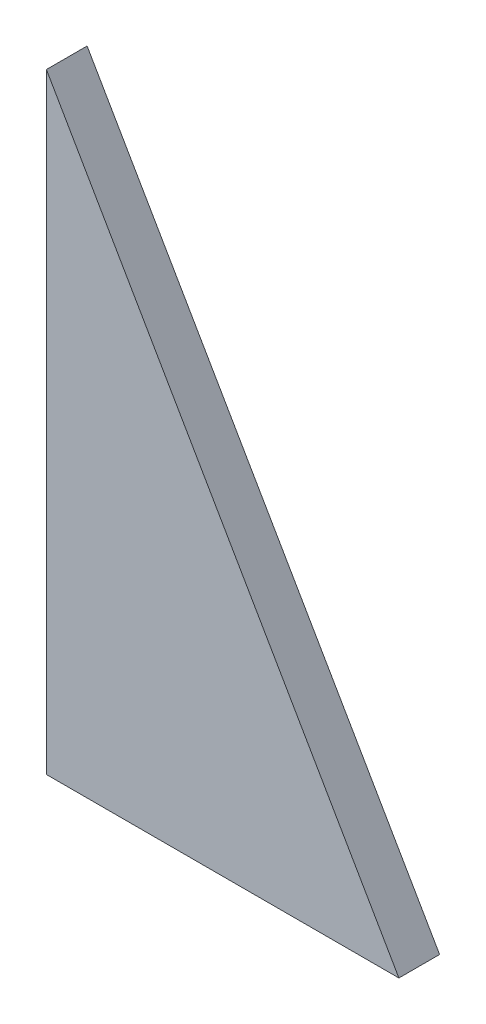
ISO-10303-21;
HEADER;
FILE_DESCRIPTION(('STEP AP214'),'2;1');
FILE_NAME('part.step','',(''),(''),'','','');
FILE_SCHEMA(('AUTOMOTIVE_DESIGN { 1 0 10303 214 1 1 1 1 }'));
ENDSEC;
DATA;
#1=APPLICATION_CONTEXT('core data for automotive mechanical design processes');
#2=APPLICATION_PROTOCOL_DEFINITION('international standard','automotive_design',2000,#1);
#3=PRODUCT_CONTEXT('',#1,'mechanical');
#4=PRODUCT('Part','Part','',(#3));
#5=PRODUCT_RELATED_PRODUCT_CATEGORY('part','',(#4));
#6=PRODUCT_DEFINITION_FORMATION('','',#4);
#7=PRODUCT_DEFINITION_CONTEXT('part definition',#1,'design');
#8=PRODUCT_DEFINITION('design','',#6,#7);
#9=PRODUCT_DEFINITION_SHAPE('','',#8);
#10=(LENGTH_UNIT() NAMED_UNIT(*) SI_UNIT(.MILLI.,.METRE.));
#11=(NAMED_UNIT(*) PLANE_ANGLE_UNIT() SI_UNIT($,.RADIAN.));
#12=(NAMED_UNIT(*) SI_UNIT($,.STERADIAN.) SOLID_ANGLE_UNIT());
#13=UNCERTAINTY_MEASURE_WITH_UNIT(LENGTH_MEASURE(1.E-05),#10,'distance_accuracy_value','');
#14=(GEOMETRIC_REPRESENTATION_CONTEXT(3) GLOBAL_UNCERTAINTY_ASSIGNED_CONTEXT((#13)) GLOBAL_UNIT_ASSIGNED_CONTEXT((#10,
#11,#12)) REPRESENTATION_CONTEXT('',''));
#15=CARTESIAN_POINT('',(0.,0.,0.));
#16=DIRECTION('',(0.,0.,1.));
#17=DIRECTION('',(1.,0.,0.));
#18=AXIS2_PLACEMENT_3D('',#15,#16,#17);
#19=CARTESIAN_POINT('',(0.,0.,1.));
#20=DIRECTION('',(-0.866025403784433,-0.50000000000001,0.));
#21=DIRECTION('',(0.50000000000001,-0.866025403784433,0.));
#22=AXIS2_PLACEMENT_3D('',#19,#20,#21);
#23=PLANE('',#22);
#24=DIRECTION('',(-0.50000000000001,0.866025403784433,0.));
#25=VECTOR('',#24,1.);
#26=CARTESIAN_POINT('',(0.,0.,0.));
#27=LINE('',#26,#25);
#28=CARTESIAN_POINT('',(0.,0.,0.));
#29=VERTEX_POINT('',#28);
#30=CARTESIAN_POINT('',(-8.66025403784463,15.,0.));
#31=VERTEX_POINT('',#30);
#32=EDGE_CURVE('E70',#29,#31,#27,.T.);
#33=ORIENTED_EDGE('',*,*,#32,.T.);
#34=DIRECTION('',(0.,0.,-1.));
#35=VECTOR('',#34,1.);
#36=CARTESIAN_POINT('',(-8.66025403784463,15.,1.));
#37=LINE('',#36,#35);
#38=CARTESIAN_POINT('',(-8.66025403784463,15.,1.));
#39=VERTEX_POINT('',#38);
#40=EDGE_CURVE('E48',#39,#31,#37,.T.);
#41=ORIENTED_EDGE('',*,*,#40,.F.);
#42=DIRECTION('',(-0.50000000000001,0.866025403784433,0.));
#43=VECTOR('',#42,1.);
#44=CARTESIAN_POINT('',(0.,0.,1.));
#45=LINE('',#44,#43);
#46=CARTESIAN_POINT('',(0.,0.,1.));
#47=VERTEX_POINT('',#46);
#48=EDGE_CURVE('E78',#47,#39,#45,.T.);
#49=ORIENTED_EDGE('',*,*,#48,.F.);
#50=DIRECTION('',(0.,0.,-1.));
#51=VECTOR('',#50,1.);
#52=CARTESIAN_POINT('',(0.,0.,1.));
#53=LINE('',#52,#51);
#54=EDGE_CURVE('E11',#47,#29,#53,.T.);
#55=ORIENTED_EDGE('',*,*,#54,.T.);
#56=EDGE_LOOP('',(#33,#41,#49,#55));
#57=FACE_BOUND('',#56,.T.);
#58=ADVANCED_FACE('F39',(#57),#23,.F.);
#59=CARTESIAN_POINT('',(-8.66025403784463,15.,1.));
#60=DIRECTION('',(1.,0.,0.));
#61=DIRECTION('',(0.,0.,-1.));
#62=AXIS2_PLACEMENT_3D('',#59,#60,#61);
#63=PLANE('',#62);
#64=DIRECTION('',(0.,-1.,0.));
#65=VECTOR('',#64,1.);
#66=CARTESIAN_POINT('',(-8.66025403784463,15.,0.));
#67=LINE('',#66,#65);
#68=CARTESIAN_POINT('',(-8.66025403784463,0.,0.));
#69=VERTEX_POINT('',#68);
#70=EDGE_CURVE('E76',#31,#69,#67,.T.);
#71=ORIENTED_EDGE('',*,*,#70,.T.);
#72=DIRECTION('',(0.,0.,-1.));
#73=VECTOR('',#72,1.);
#74=CARTESIAN_POINT('',(-8.66025403784463,0.,1.));
#75=LINE('',#74,#73);
#76=CARTESIAN_POINT('',(-8.66025403784463,0.,1.));
#77=VERTEX_POINT('',#76);
#78=EDGE_CURVE('E90',#77,#69,#75,.T.);
#79=ORIENTED_EDGE('',*,*,#78,.F.);
#80=DIRECTION('',(0.,-1.,0.));
#81=VECTOR('',#80,1.);
#82=CARTESIAN_POINT('',(-8.66025403784463,15.,1.));
#83=LINE('',#82,#81);
#84=EDGE_CURVE('E82',#39,#77,#83,.T.);
#85=ORIENTED_EDGE('',*,*,#84,.F.);
#86=ORIENTED_EDGE('',*,*,#40,.T.);
#87=EDGE_LOOP('',(#71,#79,#85,#86));
#88=FACE_BOUND('',#87,.T.);
#89=ADVANCED_FACE('F103',(#88),#63,.F.);
#90=CARTESIAN_POINT('',(-8.66025403784463,0.,1.));
#91=DIRECTION('',(0.,1.,0.));
#92=DIRECTION('',(0.,0.,1.));
#93=AXIS2_PLACEMENT_3D('',#90,#91,#92);
#94=PLANE('',#93);
#95=DIRECTION('',(1.,0.,0.));
#96=VECTOR('',#95,1.);
#97=CARTESIAN_POINT('',(-8.66025403784463,0.,0.));
#98=LINE('',#97,#96);
#99=EDGE_CURVE('E86',#69,#29,#98,.T.);
#100=ORIENTED_EDGE('',*,*,#99,.T.);
#101=ORIENTED_EDGE('',*,*,#54,.F.);
#102=DIRECTION('',(1.,0.,0.));
#103=VECTOR('',#102,1.);
#104=CARTESIAN_POINT('',(-2.20614798354346,0.,1.));
#105=LINE('',#104,#103);
#106=EDGE_CURVE('E56',#77,#47,#105,.T.);
#107=ORIENTED_EDGE('',*,*,#106,.F.);
#108=ORIENTED_EDGE('',*,*,#78,.T.);
#109=EDGE_LOOP('',(#100,#101,#107,#108));
#110=FACE_BOUND('',#109,.T.);
#111=ADVANCED_FACE('F88',(#110),#94,.F.);
#112=CARTESIAN_POINT('',(0.,0.,1.));
#113=DIRECTION('',(0.,0.,-1.));
#114=DIRECTION('',(-1.,0.,0.));
#115=AXIS2_PLACEMENT_3D('',#112,#113,#114);
#116=PLANE('',#115);
#117=ORIENTED_EDGE('',*,*,#106,.T.);
#118=ORIENTED_EDGE('',*,*,#48,.T.);
#119=ORIENTED_EDGE('',*,*,#84,.T.);
#120=EDGE_LOOP('',(#117,#118,#119));
#121=FACE_BOUND('',#120,.T.);
#122=ADVANCED_FACE('F84',(#121),#116,.F.);
#123=CARTESIAN_POINT('',(0.,0.,0.));
#124=DIRECTION('',(0.,0.,-1.));
#125=DIRECTION('',(-1.,0.,0.));
#126=AXIS2_PLACEMENT_3D('',#123,#124,#125);
#127=PLANE('',#126);
#128=ORIENTED_EDGE('',*,*,#32,.F.);
#129=ORIENTED_EDGE('',*,*,#99,.F.);
#130=ORIENTED_EDGE('',*,*,#70,.F.);
#131=EDGE_LOOP('',(#128,#129,#130));
#132=FACE_BOUND('',#131,.T.);
#133=ADVANCED_FACE('F94',(#132),#127,.T.);
#134=CLOSED_SHELL('',(#58,#89,#111,#122,#133));
#135=MANIFOLD_SOLID_BREP('B2',#134);
#136=ADVANCED_BREP_SHAPE_REPRESENTATION('',(#18,#135),#14);
#137=SHAPE_DEFINITION_REPRESENTATION(#9,#136);
ENDSEC;
END-ISO-10303-21;
